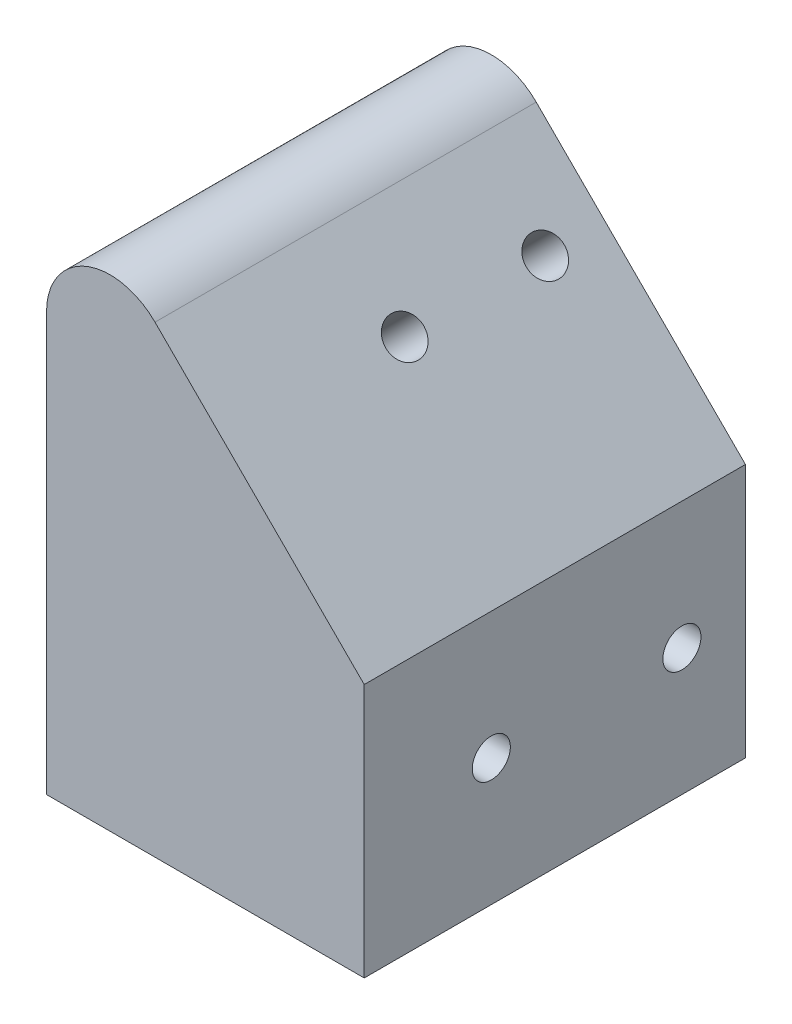
ISO-10303-21;
HEADER;
FILE_DESCRIPTION(('STEP AP214'),'2;1');
FILE_NAME('part.step','',(''),(''),'','','');
FILE_SCHEMA(('AUTOMOTIVE_DESIGN { 1 0 10303 214 1 1 1 1 }'));
ENDSEC;
DATA;
#1=APPLICATION_CONTEXT('core data for automotive mechanical design processes');
#2=APPLICATION_PROTOCOL_DEFINITION('international standard','automotive_design',2000,#1);
#3=PRODUCT_CONTEXT('',#1,'mechanical');
#4=PRODUCT('Part','Part','',(#3));
#5=PRODUCT_RELATED_PRODUCT_CATEGORY('part','',(#4));
#6=PRODUCT_DEFINITION_FORMATION('','',#4);
#7=PRODUCT_DEFINITION_CONTEXT('part definition',#1,'design');
#8=PRODUCT_DEFINITION('design','',#6,#7);
#9=PRODUCT_DEFINITION_SHAPE('','',#8);
#10=(LENGTH_UNIT() NAMED_UNIT(*) SI_UNIT(.MILLI.,.METRE.));
#11=(NAMED_UNIT(*) PLANE_ANGLE_UNIT() SI_UNIT($,.RADIAN.));
#12=(NAMED_UNIT(*) SI_UNIT($,.STERADIAN.) SOLID_ANGLE_UNIT());
#13=UNCERTAINTY_MEASURE_WITH_UNIT(LENGTH_MEASURE(1.E-05),#10,'distance_accuracy_value','');
#14=(GEOMETRIC_REPRESENTATION_CONTEXT(3) GLOBAL_UNCERTAINTY_ASSIGNED_CONTEXT((#13)) GLOBAL_UNIT_ASSIGNED_CONTEXT((#10,
#11,#12)) REPRESENTATION_CONTEXT('',''));
#15=CARTESIAN_POINT('',(0.,0.,0.));
#16=DIRECTION('',(0.,0.,1.));
#17=DIRECTION('',(1.,0.,0.));
#18=AXIS2_PLACEMENT_3D('',#15,#16,#17);
#19=CARTESIAN_POINT('',(25.,-20.,0.));
#20=DIRECTION('',(0.,0.,1.));
#21=DIRECTION('',(1.,0.,0.));
#22=AXIS2_PLACEMENT_3D('',#19,#20,#21);
#23=PLANE('',#22);
#24=DIRECTION('',(0.,1.,0.));
#25=VECTOR('',#24,1.);
#26=CARTESIAN_POINT('',(0.,-20.,0.));
#27=LINE('',#26,#25);
#28=CARTESIAN_POINT('',(0.,-20.,0.));
#29=VERTEX_POINT('',#28);
#30=CARTESIAN_POINT('',(0.,12.9289321881344,0.));
#31=VERTEX_POINT('',#30);
#32=EDGE_CURVE('E101',#29,#31,#27,.T.);
#33=ORIENTED_EDGE('',*,*,#32,.T.);
#34=CARTESIAN_POINT('',(5.,12.9289321881344,0.));
#35=DIRECTION('',(0.,0.,1.));
#36=DIRECTION('',(1.,0.,0.));
#37=AXIS2_PLACEMENT_3D('',#34,#35,#36);
#38=CIRCLE('',#37,5.);
#39=CARTESIAN_POINT('',(8.53553390593272,16.4644660940671,0.));
#40=VERTEX_POINT('',#39);
#41=EDGE_CURVE('E55',#31,#40,#38,.F.);
#42=ORIENTED_EDGE('',*,*,#41,.T.);
#43=DIRECTION('',(0.707106781186551,-0.707106781186544,0.));
#44=VECTOR('',#43,1.);
#45=CARTESIAN_POINT('',(0.,24.9999999999997,0.));
#46=LINE('',#45,#44);
#47=CARTESIAN_POINT('',(25.,0.,0.));
#48=VERTEX_POINT('',#47);
#49=EDGE_CURVE('E76',#40,#48,#46,.T.);
#50=ORIENTED_EDGE('',*,*,#49,.T.);
#51=DIRECTION('',(0.,1.,0.));
#52=VECTOR('',#51,1.);
#53=CARTESIAN_POINT('',(25.,-20.,0.));
#54=LINE('',#53,#52);
#55=CARTESIAN_POINT('',(25.,-20.,0.));
#56=VERTEX_POINT('',#55);
#57=EDGE_CURVE('E79',#56,#48,#54,.T.);
#58=ORIENTED_EDGE('',*,*,#57,.F.);
#59=DIRECTION('',(-1.,0.,0.));
#60=VECTOR('',#59,1.);
#61=CARTESIAN_POINT('',(25.,-20.,0.));
#62=LINE('',#61,#60);
#63=EDGE_CURVE('E100',#56,#29,#62,.T.);
#64=ORIENTED_EDGE('',*,*,#63,.T.);
#65=EDGE_LOOP('',(#33,#42,#50,#58,#64));
#66=FACE_BOUND('',#65,.T.);
#67=ADVANCED_FACE('F33',(#66),#23,.F.);
#68=CARTESIAN_POINT('',(25.,-20.,30.));
#69=DIRECTION('',(0.,0.,-1.));
#70=DIRECTION('',(-1.,0.,0.));
#71=AXIS2_PLACEMENT_3D('',#68,#69,#70);
#72=PLANE('',#71);
#73=DIRECTION('',(0.707106781186551,-0.707106781186544,0.));
#74=VECTOR('',#73,1.);
#75=CARTESIAN_POINT('',(0.,24.9999999999997,30.));
#76=LINE('',#75,#74);
#77=CARTESIAN_POINT('',(8.53553390593272,16.4644660940671,30.));
#78=VERTEX_POINT('',#77);
#79=CARTESIAN_POINT('',(25.,0.,30.));
#80=VERTEX_POINT('',#79);
#81=EDGE_CURVE('E81',#78,#80,#76,.T.);
#82=ORIENTED_EDGE('',*,*,#81,.F.);
#83=CARTESIAN_POINT('',(5.,12.9289321881344,30.));
#84=DIRECTION('',(0.,0.,-1.));
#85=DIRECTION('',(-1.,0.,0.));
#86=AXIS2_PLACEMENT_3D('',#83,#84,#85);
#87=CIRCLE('',#86,5.);
#88=CARTESIAN_POINT('',(0.,12.9289321881344,30.));
#89=VERTEX_POINT('',#88);
#90=EDGE_CURVE('E11',#78,#89,#87,.F.);
#91=ORIENTED_EDGE('',*,*,#90,.T.);
#92=DIRECTION('',(0.,-1.,0.));
#93=VECTOR('',#92,1.);
#94=CARTESIAN_POINT('',(0.,-20.,30.));
#95=LINE('',#94,#93);
#96=CARTESIAN_POINT('',(0.,-20.,30.));
#97=VERTEX_POINT('',#96);
#98=EDGE_CURVE('E103',#89,#97,#95,.T.);
#99=ORIENTED_EDGE('',*,*,#98,.T.);
#100=DIRECTION('',(-1.,0.,0.));
#101=VECTOR('',#100,1.);
#102=CARTESIAN_POINT('',(25.,-20.,30.));
#103=LINE('',#102,#101);
#104=CARTESIAN_POINT('',(25.,-20.,30.));
#105=VERTEX_POINT('',#104);
#106=EDGE_CURVE('E107',#105,#97,#103,.T.);
#107=ORIENTED_EDGE('',*,*,#106,.F.);
#108=DIRECTION('',(0.,-1.,0.));
#109=VECTOR('',#108,1.);
#110=CARTESIAN_POINT('',(25.,-20.,30.));
#111=LINE('',#110,#109);
#112=EDGE_CURVE('E95',#80,#105,#111,.T.);
#113=ORIENTED_EDGE('',*,*,#112,.F.);
#114=EDGE_LOOP('',(#82,#91,#99,#107,#113));
#115=FACE_BOUND('',#114,.T.);
#116=ADVANCED_FACE('F125',(#115),#72,.F.);
#117=CARTESIAN_POINT('',(25.,-20.,0.));
#118=DIRECTION('',(0.,1.,0.));
#119=DIRECTION('',(0.,0.,1.));
#120=AXIS2_PLACEMENT_3D('',#117,#118,#119);
#121=PLANE('',#120);
#122=DIRECTION('',(0.,0.,-1.));
#123=VECTOR('',#122,1.);
#124=CARTESIAN_POINT('',(0.,-20.,0.));
#125=LINE('',#124,#123);
#126=EDGE_CURVE('E92',#97,#29,#125,.T.);
#127=ORIENTED_EDGE('',*,*,#126,.T.);
#128=ORIENTED_EDGE('',*,*,#63,.F.);
#129=DIRECTION('',(0.,0.,-1.));
#130=VECTOR('',#129,1.);
#131=CARTESIAN_POINT('',(25.,-20.,0.));
#132=LINE('',#131,#130);
#133=EDGE_CURVE('E90',#105,#56,#132,.T.);
#134=ORIENTED_EDGE('',*,*,#133,.F.);
#135=ORIENTED_EDGE('',*,*,#106,.T.);
#136=EDGE_LOOP('',(#127,#128,#134,#135));
#137=FACE_BOUND('',#136,.T.);
#138=ADVANCED_FACE('F122',(#137),#121,.F.);
#139=CARTESIAN_POINT('',(25.,0.,0.));
#140=DIRECTION('',(1.,0.,0.));
#141=DIRECTION('',(0.,0.,-1.));
#142=AXIS2_PLACEMENT_3D('',#139,#140,#141);
#143=PLANE('',#142);
#144=CARTESIAN_POINT('',(25.,-9.99999999999998,4.99999999999714));
#145=DIRECTION('',(-1.,0.,0.));
#146=DIRECTION('',(0.,0.,1.));
#147=AXIS2_PLACEMENT_3D('',#144,#145,#146);
#148=CIRCLE('',#147,1.5);
#149=CARTESIAN_POINT('',(25.,-9.99999999999998,6.49999999999714));
#150=VERTEX_POINT('',#149);
#151=EDGE_CURVE('E180',#150,#150,#148,.T.);
#152=ORIENTED_EDGE('',*,*,#151,.T.);
#153=EDGE_LOOP('',(#152));
#154=FACE_BOUND('',#153,.T.);
#155=CARTESIAN_POINT('',(25.,-9.99999999999998,19.9999999999971));
#156=DIRECTION('',(-1.,0.,0.));
#157=DIRECTION('',(0.,0.,1.));
#158=AXIS2_PLACEMENT_3D('',#155,#156,#157);
#159=CIRCLE('',#158,1.5);
#160=CARTESIAN_POINT('',(25.,-9.99999999999998,21.4999999999971));
#161=VERTEX_POINT('',#160);
#162=EDGE_CURVE('E82',#161,#161,#159,.T.);
#163=ORIENTED_EDGE('',*,*,#162,.T.);
#164=EDGE_LOOP('',(#163));
#165=FACE_BOUND('',#164,.T.);
#166=ORIENTED_EDGE('',*,*,#57,.T.);
#167=DIRECTION('',(0.,0.,1.));
#168=VECTOR('',#167,1.);
#169=CARTESIAN_POINT('',(25.,0.,0.));
#170=LINE('',#169,#168);
#171=EDGE_CURVE('E87',#48,#80,#170,.T.);
#172=ORIENTED_EDGE('',*,*,#171,.T.);
#173=ORIENTED_EDGE('',*,*,#112,.T.);
#174=ORIENTED_EDGE('',*,*,#133,.T.);
#175=EDGE_LOOP('',(#166,#172,#173,#174));
#176=FACE_BOUND('',#175,.T.);
#177=ADVANCED_FACE('F86',(#154,#165,#176),#143,.T.);
#178=CARTESIAN_POINT('',(0.,0.,0.));
#179=DIRECTION('',(1.,0.,0.));
#180=DIRECTION('',(0.,0.,-1.));
#181=AXIS2_PLACEMENT_3D('',#178,#179,#180);
#182=PLANE('',#181);
#183=CARTESIAN_POINT('',(0.,-2.89921398054698,4.70709262363377));
#184=DIRECTION('',(1.,0.,0.));
#185=DIRECTION('',(0.,1.,0.));
#186=AXIS2_PLACEMENT_3D('',#183,#184,#185);
#187=ELLIPSE('',#186,2.12132034355965,1.5);
#188=CARTESIAN_POINT('',(0.,-0.777893636987326,4.70709262363377));
#189=VERTEX_POINT('',#188);
#190=EDGE_CURVE('E169',#189,#189,#187,.T.);
#191=ORIENTED_EDGE('',*,*,#190,.T.);
#192=EDGE_LOOP('',(#191));
#193=FACE_BOUND('',#192,.T.);
#194=CARTESIAN_POINT('',(0.,-2.89921398054697,15.7630556831621));
#195=DIRECTION('',(1.,0.,0.));
#196=DIRECTION('',(0.,1.,0.));
#197=AXIS2_PLACEMENT_3D('',#194,#195,#196);
#198=ELLIPSE('',#197,2.12132034355965,1.5);
#199=CARTESIAN_POINT('',(0.,-0.777893636987312,15.7630556831621));
#200=VERTEX_POINT('',#199);
#201=EDGE_CURVE('E173',#200,#200,#198,.T.);
#202=ORIENTED_EDGE('',*,*,#201,.T.);
#203=EDGE_LOOP('',(#202));
#204=FACE_BOUND('',#203,.T.);
#205=CARTESIAN_POINT('',(0.,-9.99999999999998,4.99999999999714));
#206=DIRECTION('',(-1.,0.,0.));
#207=DIRECTION('',(0.,0.,1.));
#208=AXIS2_PLACEMENT_3D('',#205,#206,#207);
#209=CIRCLE('',#208,1.5);
#210=CARTESIAN_POINT('',(0.,-9.99999999999998,6.49999999999714));
#211=VERTEX_POINT('',#210);
#212=EDGE_CURVE('E179',#211,#211,#209,.T.);
#213=ORIENTED_EDGE('',*,*,#212,.F.);
#214=EDGE_LOOP('',(#213));
#215=FACE_BOUND('',#214,.T.);
#216=CARTESIAN_POINT('',(0.,-9.99999999999998,19.9999999999971));
#217=DIRECTION('',(-1.,0.,0.));
#218=DIRECTION('',(0.,0.,1.));
#219=AXIS2_PLACEMENT_3D('',#216,#217,#218);
#220=CIRCLE('',#219,1.5);
#221=CARTESIAN_POINT('',(0.,-9.99999999999998,21.4999999999971));
#222=VERTEX_POINT('',#221);
#223=EDGE_CURVE('E183',#222,#222,#220,.T.);
#224=ORIENTED_EDGE('',*,*,#223,.F.);
#225=EDGE_LOOP('',(#224));
#226=FACE_BOUND('',#225,.T.);
#227=ORIENTED_EDGE('',*,*,#98,.F.);
#228=DIRECTION('',(0.,0.,-1.));
#229=VECTOR('',#228,1.);
#230=CARTESIAN_POINT('',(0.,12.9289321881344,0.));
#231=LINE('',#230,#229);
#232=EDGE_CURVE('E110',#89,#31,#231,.T.);
#233=ORIENTED_EDGE('',*,*,#232,.T.);
#234=ORIENTED_EDGE('',*,*,#32,.F.);
#235=ORIENTED_EDGE('',*,*,#126,.F.);
#236=EDGE_LOOP('',(#227,#233,#234,#235));
#237=FACE_BOUND('',#236,.T.);
#238=ADVANCED_FACE('F117',(#193,#204,#215,#226,#237),#182,.F.);
#239=CARTESIAN_POINT('',(0.,24.9999999999997,30.));
#240=DIRECTION('',(0.707106781186544,0.707106781186551,0.));
#241=DIRECTION('',(-0.707106781186551,0.707106781186544,0.));
#242=AXIS2_PLACEMENT_3D('',#239,#240,#241);
#243=PLANE('',#242);
#244=CARTESIAN_POINT('',(13.9496069902734,11.0503930097265,4.70709262363377));
#245=DIRECTION('',(0.707106781186544,0.707106781186551,0.));
#246=DIRECTION('',(-0.707106781186551,0.707106781186544,0.));
#247=AXIS2_PLACEMENT_3D('',#244,#245,#246);
#248=CIRCLE('',#247,1.5);
#249=CARTESIAN_POINT('',(12.8889468184935,12.1110531815063,4.70709262363377));
#250=VERTEX_POINT('',#249);
#251=EDGE_CURVE('E166',#250,#250,#248,.T.);
#252=ORIENTED_EDGE('',*,*,#251,.F.);
#253=EDGE_LOOP('',(#252));
#254=FACE_BOUND('',#253,.T.);
#255=CARTESIAN_POINT('',(13.9496069902734,11.0503930097265,15.7630556831621));
#256=DIRECTION('',(0.707106781186544,0.707106781186551,0.));
#257=DIRECTION('',(-0.707106781186551,0.707106781186544,0.));
#258=AXIS2_PLACEMENT_3D('',#255,#256,#257);
#259=CIRCLE('',#258,1.5);
#260=CARTESIAN_POINT('',(12.8889468184935,12.1110531815063,15.7630556831621));
#261=VERTEX_POINT('',#260);
#262=EDGE_CURVE('E170',#261,#261,#259,.T.);
#263=ORIENTED_EDGE('',*,*,#262,.F.);
#264=EDGE_LOOP('',(#263));
#265=FACE_BOUND('',#264,.T.);
#266=ORIENTED_EDGE('',*,*,#49,.F.);
#267=DIRECTION('',(0.,0.,-1.));
#268=VECTOR('',#267,1.);
#269=CARTESIAN_POINT('',(8.53553390593272,16.4644660940671,30.));
#270=LINE('',#269,#268);
#271=EDGE_CURVE('E41',#40,#78,#270,.F.);
#272=ORIENTED_EDGE('',*,*,#271,.T.);
#273=ORIENTED_EDGE('',*,*,#81,.T.);
#274=ORIENTED_EDGE('',*,*,#171,.F.);
#275=EDGE_LOOP('',(#266,#272,#273,#274));
#276=FACE_BOUND('',#275,.T.);
#277=ADVANCED_FACE('F94',(#254,#265,#276),#243,.T.);
#278=CARTESIAN_POINT('',(5.,12.9289321881344,0.));
#279=DIRECTION('',(0.,0.,1.));
#280=DIRECTION('',(1.,0.,0.));
#281=AXIS2_PLACEMENT_3D('',#278,#279,#280);
#282=CYLINDRICAL_SURFACE('',#281,5.);
#283=ORIENTED_EDGE('',*,*,#90,.F.);
#284=ORIENTED_EDGE('',*,*,#271,.F.);
#285=ORIENTED_EDGE('',*,*,#41,.F.);
#286=ORIENTED_EDGE('',*,*,#232,.F.);
#287=EDGE_LOOP('',(#283,#284,#285,#286));
#288=FACE_BOUND('',#287,.T.);
#289=ADVANCED_FACE('F35',(#288),#282,.T.);
#290=CARTESIAN_POINT('',(25.,-9.99999999999998,19.9999999999971));
#291=DIRECTION('',(-1.,0.,0.));
#292=DIRECTION('',(0.,0.,1.));
#293=AXIS2_PLACEMENT_3D('',#290,#291,#292);
#294=CYLINDRICAL_SURFACE('',#293,1.5);
#295=ORIENTED_EDGE('',*,*,#162,.F.);
#296=EDGE_LOOP('',(#295));
#297=FACE_BOUND('',#296,.T.);
#298=ORIENTED_EDGE('',*,*,#223,.T.);
#299=EDGE_LOOP('',(#298));
#300=FACE_BOUND('',#299,.T.);
#301=ADVANCED_FACE('F127',(#297,#300),#294,.F.);
#302=CARTESIAN_POINT('',(25.,-9.99999999999998,4.99999999999714));
#303=DIRECTION('',(-1.,0.,0.));
#304=DIRECTION('',(0.,0.,1.));
#305=AXIS2_PLACEMENT_3D('',#302,#303,#304);
#306=CYLINDRICAL_SURFACE('',#305,1.5);
#307=ORIENTED_EDGE('',*,*,#151,.F.);
#308=EDGE_LOOP('',(#307));
#309=FACE_BOUND('',#308,.T.);
#310=ORIENTED_EDGE('',*,*,#212,.T.);
#311=EDGE_LOOP('',(#310));
#312=FACE_BOUND('',#311,.T.);
#313=ADVANCED_FACE('F132',(#309,#312),#306,.F.);
#314=CARTESIAN_POINT('',(-8.55039300972652,-11.4496069902736,15.7630556831621));
#315=DIRECTION('',(0.707106781186544,0.707106781186551,0.));
#316=DIRECTION('',(-0.707106781186551,0.707106781186544,0.));
#317=AXIS2_PLACEMENT_3D('',#314,#315,#316);
#318=CYLINDRICAL_SURFACE('',#317,1.5);
#319=ORIENTED_EDGE('',*,*,#262,.T.);
#320=EDGE_LOOP('',(#319));
#321=FACE_BOUND('',#320,.T.);
#322=ORIENTED_EDGE('',*,*,#201,.F.);
#323=EDGE_LOOP('',(#322));
#324=FACE_BOUND('',#323,.T.);
#325=ADVANCED_FACE('F153',(#321,#324),#318,.F.);
#326=CARTESIAN_POINT('',(-8.55039300972651,-11.4496069902736,4.70709262363377));
#327=DIRECTION('',(0.707106781186544,0.707106781186551,0.));
#328=DIRECTION('',(-0.707106781186551,0.707106781186544,0.));
#329=AXIS2_PLACEMENT_3D('',#326,#327,#328);
#330=CYLINDRICAL_SURFACE('',#329,1.5);
#331=ORIENTED_EDGE('',*,*,#251,.T.);
#332=EDGE_LOOP('',(#331));
#333=FACE_BOUND('',#332,.T.);
#334=ORIENTED_EDGE('',*,*,#190,.F.);
#335=EDGE_LOOP('',(#334));
#336=FACE_BOUND('',#335,.T.);
#337=ADVANCED_FACE('F157',(#333,#336),#330,.F.);
#338=CLOSED_SHELL('',(#67,#116,#138,#177,#238,#277,#289,#301,#313,#325,#337));
#339=MANIFOLD_SOLID_BREP('B2',#338);
#340=ADVANCED_BREP_SHAPE_REPRESENTATION('',(#18,#339),#14);
#341=SHAPE_DEFINITION_REPRESENTATION(#9,#340);
ENDSEC;
END-ISO-10303-21;
